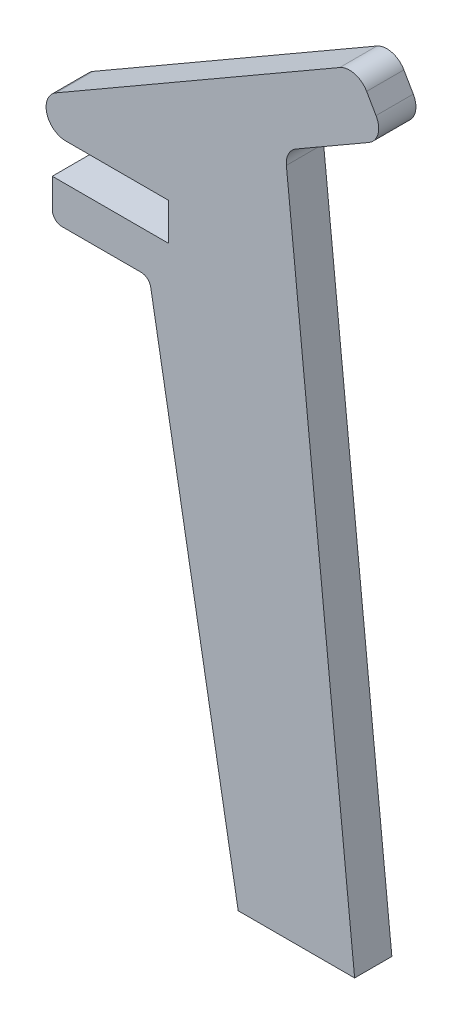
ISO-10303-21;
HEADER;
FILE_DESCRIPTION(('STEP AP214'),'2;1');
FILE_NAME('part.step','',(''),(''),'','','');
FILE_SCHEMA(('AUTOMOTIVE_DESIGN { 1 0 10303 214 1 1 1 1 }'));
ENDSEC;
DATA;
#1=APPLICATION_CONTEXT('core data for automotive mechanical design processes');
#2=APPLICATION_PROTOCOL_DEFINITION('international standard','automotive_design',2000,#1);
#3=PRODUCT_CONTEXT('',#1,'mechanical');
#4=PRODUCT('Part','Part','',(#3));
#5=PRODUCT_RELATED_PRODUCT_CATEGORY('part','',(#4));
#6=PRODUCT_DEFINITION_FORMATION('','',#4);
#7=PRODUCT_DEFINITION_CONTEXT('part definition',#1,'design');
#8=PRODUCT_DEFINITION('design','',#6,#7);
#9=PRODUCT_DEFINITION_SHAPE('','',#8);
#10=(LENGTH_UNIT() NAMED_UNIT(*) SI_UNIT(.MILLI.,.METRE.));
#11=(NAMED_UNIT(*) PLANE_ANGLE_UNIT() SI_UNIT($,.RADIAN.));
#12=(NAMED_UNIT(*) SI_UNIT($,.STERADIAN.) SOLID_ANGLE_UNIT());
#13=UNCERTAINTY_MEASURE_WITH_UNIT(LENGTH_MEASURE(1.E-05),#10,'distance_accuracy_value','');
#14=(GEOMETRIC_REPRESENTATION_CONTEXT(3) GLOBAL_UNCERTAINTY_ASSIGNED_CONTEXT((#13)) GLOBAL_UNIT_ASSIGNED_CONTEXT((#10,
#11,#12)) REPRESENTATION_CONTEXT('',''));
#15=CARTESIAN_POINT('',(0.,0.,0.));
#16=DIRECTION('',(0.,0.,1.));
#17=DIRECTION('',(1.,0.,0.));
#18=AXIS2_PLACEMENT_3D('',#15,#16,#17);
#19=CARTESIAN_POINT('',(126.999999999998,-104.967938073636,6.096));
#20=DIRECTION('',(-0.499999999999995,0.866025403784441,0.));
#21=DIRECTION('',(-0.866025403784441,-0.499999999999995,0.));
#22=AXIS2_PLACEMENT_3D('',#19,#20,#21);
#23=PLANE('',#22);
#24=DIRECTION('',(0.866025403784441,0.499999999999995,0.));
#25=VECTOR('',#24,1.);
#26=CARTESIAN_POINT('',(126.999999999998,-104.967938073636,6.096));
#27=LINE('',#26,#25);
#28=CARTESIAN_POINT('',(130.61499035934,-102.880822416552,6.096));
#29=VERTEX_POINT('',#28);
#30=CARTESIAN_POINT('',(154.409704029776,-89.1429380736364,6.096));
#31=VERTEX_POINT('',#30);
#32=EDGE_CURVE('E225',#29,#31,#27,.T.);
#33=ORIENTED_EDGE('',*,*,#32,.F.);
#34=DIRECTION('',(0.,0.,-1.));
#35=VECTOR('',#34,1.);
#36=CARTESIAN_POINT('',(130.61499035934,-102.880822416552,-6.096));
#37=LINE('',#36,#35);
#38=CARTESIAN_POINT('',(130.61499035934,-102.880822416552,-6.096));
#39=VERTEX_POINT('',#38);
#40=EDGE_CURVE('E254',#29,#39,#37,.T.);
#41=ORIENTED_EDGE('',*,*,#40,.T.);
#42=DIRECTION('',(0.866025403784441,0.499999999999995,0.));
#43=VECTOR('',#42,1.);
#44=CARTESIAN_POINT('',(126.999999999998,-104.967938073636,-6.096));
#45=LINE('',#44,#43);
#46=CARTESIAN_POINT('',(154.409704029776,-89.1429380736364,-6.096));
#47=VERTEX_POINT('',#46);
#48=EDGE_CURVE('E199',#39,#47,#45,.T.);
#49=ORIENTED_EDGE('',*,*,#48,.T.);
#50=DIRECTION('',(0.,0.,-1.));
#51=VECTOR('',#50,1.);
#52=CARTESIAN_POINT('',(154.409704029776,-89.1429380736364,6.096));
#53=LINE('',#52,#51);
#54=EDGE_CURVE('E252',#47,#31,#53,.F.);
#55=ORIENTED_EDGE('',*,*,#54,.T.);
#56=EDGE_LOOP('',(#33,#41,#49,#55));
#57=FACE_BOUND('',#56,.T.);
#58=ADVANCED_FACE('F35',(#57),#23,.F.);
#59=CARTESIAN_POINT('',(159.995567884185,-85.9179380736364,6.096));
#60=DIRECTION('',(-0.866025403784442,-0.499999999999995,0.));
#61=DIRECTION('',(0.499999999999995,-0.866025403784442,0.));
#62=AXIS2_PLACEMENT_3D('',#59,#60,#61);
#63=PLANE('',#62);
#64=DIRECTION('',(-0.499999999999995,0.866025403784442,0.));
#65=VECTOR('',#64,1.);
#66=CARTESIAN_POINT('',(159.995567884185,-85.9179380736364,-6.096));
#67=LINE('',#66,#65);
#68=CARTESIAN_POINT('',(156.770567884185,-80.3320742192267,-6.096));
#69=VERTEX_POINT('',#68);
#70=CARTESIAN_POINT('',(153.695567884185,-75.0060179859524,-6.096));
#71=VERTEX_POINT('',#70);
#72=EDGE_CURVE('E202',#69,#71,#67,.T.);
#73=ORIENTED_EDGE('',*,*,#72,.T.);
#74=DIRECTION('',(0.,0.,-1.));
#75=VECTOR('',#74,1.);
#76=CARTESIAN_POINT('',(153.695567884185,-75.0060179859524,6.096));
#77=LINE('',#76,#75);
#78=CARTESIAN_POINT('',(153.695567884185,-75.0060179859524,6.096));
#79=VERTEX_POINT('',#78);
#80=EDGE_CURVE('E262',#71,#79,#77,.F.);
#81=ORIENTED_EDGE('',*,*,#80,.T.);
#82=DIRECTION('',(-0.499999999999995,0.866025403784442,0.));
#83=VECTOR('',#82,1.);
#84=CARTESIAN_POINT('',(159.995567884185,-85.9179380736364,6.096));
#85=LINE('',#84,#83);
#86=CARTESIAN_POINT('',(156.770567884185,-80.3320742192267,6.096));
#87=VERTEX_POINT('',#86);
#88=EDGE_CURVE('E322',#87,#79,#85,.T.);
#89=ORIENTED_EDGE('',*,*,#88,.F.);
#90=DIRECTION('',(0.,0.,-1.));
#91=VECTOR('',#90,1.);
#92=CARTESIAN_POINT('',(156.770567884185,-80.3320742192267,6.096));
#93=LINE('',#92,#91);
#94=EDGE_CURVE('E259',#87,#69,#93,.T.);
#95=ORIENTED_EDGE('',*,*,#94,.T.);
#96=EDGE_LOOP('',(#73,#81,#89,#95));
#97=FACE_BOUND('',#96,.T.);
#98=ADVANCED_FACE('F319',(#97),#63,.F.);
#99=CARTESIAN_POINT('',(150.470567884185,-69.4201541315428,6.096));
#100=DIRECTION('',(0.499999999999995,-0.866025403784442,0.));
#101=DIRECTION('',(0.866025403784442,0.499999999999995,0.));
#102=AXIS2_PLACEMENT_3D('',#99,#100,#101);
#103=PLANE('',#102);
#104=DIRECTION('',(-0.866025403784442,-0.499999999999995,0.));
#105=VECTOR('',#104,1.);
#106=CARTESIAN_POINT('',(150.470567884185,-69.4201541315428,-6.096));
#107=LINE('',#106,#105);
#108=CARTESIAN_POINT('',(144.884704029776,-72.6451541315427,-6.096));
#109=VERTEX_POINT('',#108);
#110=CARTESIAN_POINT('',(51.9927334216008,-126.276358367727,-6.096));
#111=VERTEX_POINT('',#110);
#112=EDGE_CURVE('E205',#109,#111,#107,.T.);
#113=ORIENTED_EDGE('',*,*,#112,.T.);
#114=DIRECTION('',(0.,0.,-1.));
#115=VECTOR('',#114,1.);
#116=CARTESIAN_POINT('',(51.9927334216008,-126.276358367727,6.096));
#117=LINE('',#116,#115);
#118=CARTESIAN_POINT('',(51.9927334216008,-126.276358367727,6.096));
#119=VERTEX_POINT('',#118);
#120=EDGE_CURVE('E245',#111,#119,#117,.F.);
#121=ORIENTED_EDGE('',*,*,#120,.T.);
#122=DIRECTION('',(-0.866025403784442,-0.499999999999995,0.));
#123=VECTOR('',#122,1.);
#124=CARTESIAN_POINT('',(150.470567884185,-69.4201541315428,6.096));
#125=LINE('',#124,#123);
#126=CARTESIAN_POINT('',(144.884704029776,-72.6451541315427,6.096));
#127=VERTEX_POINT('',#126);
#128=EDGE_CURVE('E166',#127,#119,#125,.T.);
#129=ORIENTED_EDGE('',*,*,#128,.F.);
#130=DIRECTION('',(0.,0.,-1.));
#131=VECTOR('',#130,1.);
#132=CARTESIAN_POINT('',(144.884704029776,-72.6451541315427,6.096));
#133=LINE('',#132,#131);
#134=EDGE_CURVE('E242',#127,#109,#133,.T.);
#135=ORIENTED_EDGE('',*,*,#134,.T.);
#136=EDGE_LOOP('',(#113,#121,#129,#135));
#137=FACE_BOUND('',#136,.T.);
#138=ADVANCED_FACE('F348',(#137),#103,.F.);
#139=CARTESIAN_POINT('',(31.1460057127812,-138.312222222136,6.096));
#140=DIRECTION('',(0.,1.,0.));
#141=DIRECTION('',(-1.,0.,0.));
#142=AXIS2_PLACEMENT_3D('',#139,#140,#141);
#143=PLANE('',#142);
#144=DIRECTION('',(1.,0.,0.));
#145=VECTOR('',#144,1.);
#146=CARTESIAN_POINT('',(31.1460057127812,-138.312222222136,6.096));
#147=LINE('',#146,#145);
#148=CARTESIAN_POINT('',(55.2177334216008,-138.312222222136,6.096));
#149=VERTEX_POINT('',#148);
#150=CARTESIAN_POINT('',(88.9,-138.312222222136,6.096));
#151=VERTEX_POINT('',#150);
#152=EDGE_CURVE('E154',#149,#151,#147,.T.);
#153=ORIENTED_EDGE('',*,*,#152,.F.);
#154=DIRECTION('',(0.,0.,-1.));
#155=VECTOR('',#154,1.);
#156=CARTESIAN_POINT('',(55.2177334216008,-138.312222222136,6.096));
#157=LINE('',#156,#155);
#158=CARTESIAN_POINT('',(55.2177334216008,-138.312222222136,-6.096));
#159=VERTEX_POINT('',#158);
#160=EDGE_CURVE('E175',#149,#159,#157,.T.);
#161=ORIENTED_EDGE('',*,*,#160,.T.);
#162=DIRECTION('',(1.,0.,0.));
#163=VECTOR('',#162,1.);
#164=CARTESIAN_POINT('',(31.1460057127812,-138.312222222136,-6.096));
#165=LINE('',#164,#163);
#166=CARTESIAN_POINT('',(88.9,-138.312222222136,-6.096));
#167=VERTEX_POINT('',#166);
#168=EDGE_CURVE('E172',#159,#167,#165,.T.);
#169=ORIENTED_EDGE('',*,*,#168,.T.);
#170=DIRECTION('',(0.,0.,-1.));
#171=VECTOR('',#170,1.);
#172=CARTESIAN_POINT('',(88.9,-138.312222222136,6.096));
#173=LINE('',#172,#171);
#174=EDGE_CURVE('E169',#151,#167,#173,.T.);
#175=ORIENTED_EDGE('',*,*,#174,.F.);
#176=EDGE_LOOP('',(#153,#161,#169,#175));
#177=FACE_BOUND('',#176,.T.);
#178=ADVANCED_FACE('F170',(#177),#143,.F.);
#179=CARTESIAN_POINT('',(88.9,-138.312222222136,6.096));
#180=DIRECTION('',(1.,0.,0.));
#181=DIRECTION('',(0.,0.,-1.));
#182=AXIS2_PLACEMENT_3D('',#179,#180,#181);
#183=PLANE('',#182);
#184=DIRECTION('',(0.,-1.,0.));
#185=VECTOR('',#184,1.);
#186=CARTESIAN_POINT('',(88.9,-138.312222222136,-6.096));
#187=LINE('',#186,#185);
#188=CARTESIAN_POINT('',(88.9,-150.504222222136,-6.096));
#189=VERTEX_POINT('',#188);
#190=EDGE_CURVE('E209',#167,#189,#187,.T.);
#191=ORIENTED_EDGE('',*,*,#190,.T.);
#192=DIRECTION('',(0.,0.,-1.));
#193=VECTOR('',#192,1.);
#194=CARTESIAN_POINT('',(88.9,-150.504222222136,6.096));
#195=LINE('',#194,#193);
#196=CARTESIAN_POINT('',(88.9,-150.504222222136,6.096));
#197=VERTEX_POINT('',#196);
#198=EDGE_CURVE('E176',#197,#189,#195,.T.);
#199=ORIENTED_EDGE('',*,*,#198,.F.);
#200=DIRECTION('',(0.,-1.,0.));
#201=VECTOR('',#200,1.);
#202=CARTESIAN_POINT('',(88.9,-138.312222222136,6.096));
#203=LINE('',#202,#201);
#204=EDGE_CURVE('E158',#151,#197,#203,.T.);
#205=ORIENTED_EDGE('',*,*,#204,.F.);
#206=ORIENTED_EDGE('',*,*,#174,.T.);
#207=EDGE_LOOP('',(#191,#199,#205,#206));
#208=FACE_BOUND('',#207,.T.);
#209=ADVANCED_FACE('F178',(#208),#183,.F.);
#210=CARTESIAN_POINT('',(50.8,-150.504222222136,6.096));
#211=DIRECTION('',(0.,-1.,0.));
#212=DIRECTION('',(1.,0.,0.));
#213=AXIS2_PLACEMENT_3D('',#210,#211,#212);
#214=PLANE('',#213);
#215=DIRECTION('',(-1.,0.,0.));
#216=VECTOR('',#215,1.);
#217=CARTESIAN_POINT('',(50.8,-150.504222222136,-6.096));
#218=LINE('',#217,#216);
#219=CARTESIAN_POINT('',(50.8,-150.504222222136,-6.096));
#220=VERTEX_POINT('',#219);
#221=EDGE_CURVE('E211',#189,#220,#218,.T.);
#222=ORIENTED_EDGE('',*,*,#221,.T.);
#223=DIRECTION('',(0.,0.,-1.));
#224=VECTOR('',#223,1.);
#225=CARTESIAN_POINT('',(50.8,-150.504222222136,6.096));
#226=LINE('',#225,#224);
#227=CARTESIAN_POINT('',(50.8,-150.504222222136,6.096));
#228=VERTEX_POINT('',#227);
#229=EDGE_CURVE('E231',#228,#220,#226,.T.);
#230=ORIENTED_EDGE('',*,*,#229,.F.);
#231=DIRECTION('',(-1.,0.,0.));
#232=VECTOR('',#231,1.);
#233=CARTESIAN_POINT('',(50.8,-150.504222222136,6.096));
#234=LINE('',#233,#232);
#235=EDGE_CURVE('E181',#197,#228,#234,.T.);
#236=ORIENTED_EDGE('',*,*,#235,.F.);
#237=ORIENTED_EDGE('',*,*,#198,.T.);
#238=EDGE_LOOP('',(#222,#230,#236,#237));
#239=FACE_BOUND('',#238,.T.);
#240=ADVANCED_FACE('F335',(#239),#214,.F.);
#241=CARTESIAN_POINT('',(50.8,-163.204222222136,6.096));
#242=DIRECTION('',(1.,0.,0.));
#243=DIRECTION('',(0.,1.,0.));
#244=AXIS2_PLACEMENT_3D('',#241,#242,#243);
#245=PLANE('',#244);
#246=DIRECTION('',(0.,-1.,0.));
#247=VECTOR('',#246,1.);
#248=CARTESIAN_POINT('',(50.8,-163.204222222136,-6.096));
#249=LINE('',#248,#247);
#250=CARTESIAN_POINT('',(50.8,-160.029222222136,-6.096));
#251=VERTEX_POINT('',#250);
#252=EDGE_CURVE('E213',#220,#251,#249,.T.);
#253=ORIENTED_EDGE('',*,*,#252,.T.);
#254=DIRECTION('',(0.,0.,-1.));
#255=VECTOR('',#254,1.);
#256=CARTESIAN_POINT('',(50.8,-160.029222222136,6.096));
#257=LINE('',#256,#255);
#258=CARTESIAN_POINT('',(50.8,-160.029222222136,6.096));
#259=VERTEX_POINT('',#258);
#260=EDGE_CURVE('E50',#251,#259,#257,.F.);
#261=ORIENTED_EDGE('',*,*,#260,.T.);
#262=DIRECTION('',(0.,-1.,0.));
#263=VECTOR('',#262,1.);
#264=CARTESIAN_POINT('',(50.8,-163.204222222136,6.096));
#265=LINE('',#264,#263);
#266=EDGE_CURVE('E183',#228,#259,#265,.T.);
#267=ORIENTED_EDGE('',*,*,#266,.F.);
#268=ORIENTED_EDGE('',*,*,#229,.T.);
#269=EDGE_LOOP('',(#253,#261,#267,#268));
#270=FACE_BOUND('',#269,.T.);
#271=ADVANCED_FACE('F412',(#270),#245,.F.);
#272=CARTESIAN_POINT('',(82.55,-163.204222222136,6.096));
#273=DIRECTION('',(0.,1.,0.));
#274=DIRECTION('',(-1.,0.,0.));
#275=AXIS2_PLACEMENT_3D('',#272,#273,#274);
#276=PLANE('',#275);
#277=DIRECTION('',(1.,0.,0.));
#278=VECTOR('',#277,1.);
#279=CARTESIAN_POINT('',(82.55,-163.204222222136,-6.096));
#280=LINE('',#279,#278);
#281=CARTESIAN_POINT('',(53.975,-163.204222222136,-6.096));
#282=VERTEX_POINT('',#281);
#283=CARTESIAN_POINT('',(79.8858586710122,-163.204222222136,-6.096));
#284=VERTEX_POINT('',#283);
#285=EDGE_CURVE('E215',#282,#284,#280,.T.);
#286=ORIENTED_EDGE('',*,*,#285,.T.);
#287=DIRECTION('',(0.,0.,-1.));
#288=VECTOR('',#287,1.);
#289=CARTESIAN_POINT('',(79.8858586710122,-163.204222222136,6.096));
#290=LINE('',#289,#288);
#291=CARTESIAN_POINT('',(79.8858586710122,-163.204222222136,6.096));
#292=VERTEX_POINT('',#291);
#293=EDGE_CURVE('E274',#284,#292,#290,.F.);
#294=ORIENTED_EDGE('',*,*,#293,.T.);
#295=DIRECTION('',(1.,0.,0.));
#296=VECTOR('',#295,1.);
#297=CARTESIAN_POINT('',(82.55,-163.204222222136,6.096));
#298=LINE('',#297,#296);
#299=CARTESIAN_POINT('',(53.975,-163.204222222136,6.096));
#300=VERTEX_POINT('',#299);
#301=EDGE_CURVE('E188',#300,#292,#298,.T.);
#302=ORIENTED_EDGE('',*,*,#301,.F.);
#303=DIRECTION('',(0.,0.,-1.));
#304=VECTOR('',#303,1.);
#305=CARTESIAN_POINT('',(53.975,-163.204222222136,6.096));
#306=LINE('',#305,#304);
#307=EDGE_CURVE('E271',#300,#282,#306,.T.);
#308=ORIENTED_EDGE('',*,*,#307,.T.);
#309=EDGE_LOOP('',(#286,#294,#302,#308));
#310=FACE_BOUND('',#309,.T.);
#311=ADVANCED_FACE('F286',(#310),#276,.F.);
#312=CARTESIAN_POINT('',(82.55,-163.204222222136,6.096));
#313=DIRECTION('',(0.984807753012208,0.173648177666931,0.));
#314=DIRECTION('',(-0.173648177666931,0.984807753012208,0.));
#315=AXIS2_PLACEMENT_3D('',#312,#313,#314);
#316=PLANE('',#315);
#317=DIRECTION('',(0.173648177666931,-0.984807753012208,0.));
#318=VECTOR('',#317,1.);
#319=CARTESIAN_POINT('',(82.55,-163.204222222136,6.096));
#320=LINE('',#319,#318);
#321=CARTESIAN_POINT('',(83.0126232868259,-165.827889258044,6.096));
#322=VERTEX_POINT('',#321);
#323=CARTESIAN_POINT('',(111.661584514968,-328.304222222136,6.096));
#324=VERTEX_POINT('',#323);
#325=EDGE_CURVE('E191',#322,#324,#320,.T.);
#326=ORIENTED_EDGE('',*,*,#325,.F.);
#327=DIRECTION('',(0.,0.,-1.));
#328=VECTOR('',#327,1.);
#329=CARTESIAN_POINT('',(83.0126232868259,-165.827889258044,-6.096));
#330=LINE('',#329,#328);
#331=CARTESIAN_POINT('',(83.0126232868259,-165.827889258044,-6.096));
#332=VERTEX_POINT('',#331);
#333=EDGE_CURVE('E268',#322,#332,#330,.T.);
#334=ORIENTED_EDGE('',*,*,#333,.T.);
#335=DIRECTION('',(0.173648177666931,-0.984807753012208,0.));
#336=VECTOR('',#335,1.);
#337=CARTESIAN_POINT('',(82.55,-163.204222222136,-6.096));
#338=LINE('',#337,#336);
#339=CARTESIAN_POINT('',(111.661584514968,-328.304222222136,-6.096));
#340=VERTEX_POINT('',#339);
#341=EDGE_CURVE('E218',#332,#340,#338,.T.);
#342=ORIENTED_EDGE('',*,*,#341,.T.);
#343=DIRECTION('',(0.,0.,-1.));
#344=VECTOR('',#343,1.);
#345=CARTESIAN_POINT('',(111.661584514968,-328.304222222136,6.096));
#346=LINE('',#345,#344);
#347=EDGE_CURVE('E228',#324,#340,#346,.T.);
#348=ORIENTED_EDGE('',*,*,#347,.F.);
#349=EDGE_LOOP('',(#326,#334,#342,#348));
#350=FACE_BOUND('',#349,.T.);
#351=ADVANCED_FACE('F294',(#350),#316,.F.);
#352=CARTESIAN_POINT('',(111.661584514968,-328.304222222136,6.096));
#353=DIRECTION('',(0.,1.,0.));
#354=DIRECTION('',(-1.,0.,0.));
#355=AXIS2_PLACEMENT_3D('',#352,#353,#354);
#356=PLANE('',#355);
#357=DIRECTION('',(1.,0.,0.));
#358=VECTOR('',#357,1.);
#359=CARTESIAN_POINT('',(111.661584514968,-328.304222222136,-6.096));
#360=LINE('',#359,#358);
#361=CARTESIAN_POINT('',(149.761584514968,-328.304222222136,-6.096));
#362=VERTEX_POINT('',#361);
#363=EDGE_CURVE('E220',#340,#362,#360,.T.);
#364=ORIENTED_EDGE('',*,*,#363,.T.);
#365=DIRECTION('',(0.,0.,-1.));
#366=VECTOR('',#365,1.);
#367=CARTESIAN_POINT('',(149.761584514968,-328.304222222136,6.096));
#368=LINE('',#367,#366);
#369=CARTESIAN_POINT('',(149.761584514968,-328.304222222136,6.096));
#370=VERTEX_POINT('',#369);
#371=EDGE_CURVE('E198',#370,#362,#368,.T.);
#372=ORIENTED_EDGE('',*,*,#371,.F.);
#373=DIRECTION('',(1.,0.,0.));
#374=VECTOR('',#373,1.);
#375=CARTESIAN_POINT('',(111.661584514968,-328.304222222136,6.096));
#376=LINE('',#375,#374);
#377=EDGE_CURVE('E193',#324,#370,#376,.T.);
#378=ORIENTED_EDGE('',*,*,#377,.F.);
#379=ORIENTED_EDGE('',*,*,#347,.T.);
#380=EDGE_LOOP('',(#364,#372,#378,#379));
#381=FACE_BOUND('',#380,.T.);
#382=ADVANCED_FACE('F298',(#381),#356,.F.);
#383=CARTESIAN_POINT('',(149.761584514968,-328.304222222136,6.096));
#384=DIRECTION('',(-0.99484665542279,-0.101390986749758,0.));
#385=DIRECTION('',(0.101390986749758,-0.99484665542279,0.));
#386=AXIS2_PLACEMENT_3D('',#383,#384,#385);
#387=PLANE('',#386);
#388=DIRECTION('',(-0.101390986749758,0.99484665542279,0.));
#389=VECTOR('',#388,1.);
#390=CARTESIAN_POINT('',(149.761584514968,-328.304222222136,-6.096));
#391=LINE('',#390,#389);
#392=CARTESIAN_POINT('',(127.423229431863,-109.120658135498,-6.096));
#393=VERTEX_POINT('',#392);
#394=EDGE_CURVE('E222',#362,#393,#391,.T.);
#395=ORIENTED_EDGE('',*,*,#394,.T.);
#396=DIRECTION('',(0.,0.,-1.));
#397=VECTOR('',#396,1.);
#398=CARTESIAN_POINT('',(127.423229431863,-109.120658135498,6.096));
#399=LINE('',#398,#397);
#400=CARTESIAN_POINT('',(127.423229431863,-109.120658135498,6.096));
#401=VERTEX_POINT('',#400);
#402=EDGE_CURVE('E257',#393,#401,#399,.F.);
#403=ORIENTED_EDGE('',*,*,#402,.T.);
#404=DIRECTION('',(-0.101390986749758,0.99484665542279,0.));
#405=VECTOR('',#404,1.);
#406=CARTESIAN_POINT('',(149.761584514968,-328.304222222136,6.096));
#407=LINE('',#406,#405);
#408=EDGE_CURVE('E195',#370,#401,#407,.T.);
#409=ORIENTED_EDGE('',*,*,#408,.F.);
#410=ORIENTED_EDGE('',*,*,#371,.T.);
#411=EDGE_LOOP('',(#395,#403,#409,#410));
#412=FACE_BOUND('',#411,.T.);
#413=ADVANCED_FACE('F392',(#412),#387,.F.);
#414=CARTESIAN_POINT('',(0.,0.,6.096));
#415=DIRECTION('',(0.,0.,1.));
#416=DIRECTION('',(1.,0.,0.));
#417=AXIS2_PLACEMENT_3D('',#414,#415,#416);
#418=PLANE('',#417);
#419=ORIENTED_EDGE('',*,*,#266,.T.);
#420=CARTESIAN_POINT('',(53.975,-160.029222222136,6.096));
#421=DIRECTION('',(0.,0.,1.));
#422=DIRECTION('',(1.,0.,0.));
#423=AXIS2_PLACEMENT_3D('',#420,#421,#422);
#424=CIRCLE('',#423,3.175);
#425=EDGE_CURVE('E278',#259,#300,#424,.T.);
#426=ORIENTED_EDGE('',*,*,#425,.T.);
#427=ORIENTED_EDGE('',*,*,#301,.T.);
#428=CARTESIAN_POINT('',(79.8858586710122,-166.379222222136,6.096));
#429=DIRECTION('',(0.,0.,1.));
#430=DIRECTION('',(1.,0.,0.));
#431=AXIS2_PLACEMENT_3D('',#428,#429,#430);
#432=CIRCLE('',#431,3.175);
#433=EDGE_CURVE('E11',#292,#322,#432,.F.);
#434=ORIENTED_EDGE('',*,*,#433,.T.);
#435=ORIENTED_EDGE('',*,*,#325,.T.);
#436=ORIENTED_EDGE('',*,*,#377,.T.);
#437=ORIENTED_EDGE('',*,*,#408,.T.);
#438=CARTESIAN_POINT('',(133.83999035934,-108.466686270962,6.096));
#439=DIRECTION('',(0.,0.,1.));
#440=DIRECTION('',(1.,0.,0.));
#441=AXIS2_PLACEMENT_3D('',#438,#439,#440);
#442=CIRCLE('',#441,6.45);
#443=EDGE_CURVE('E266',#401,#29,#442,.F.);
#444=ORIENTED_EDGE('',*,*,#443,.T.);
#445=ORIENTED_EDGE('',*,*,#32,.T.);
#446=CARTESIAN_POINT('',(151.184704029776,-83.5570742192267,6.096));
#447=DIRECTION('',(0.,0.,1.));
#448=DIRECTION('',(1.,0.,0.));
#449=AXIS2_PLACEMENT_3D('',#446,#447,#448);
#450=CIRCLE('',#449,6.45);
#451=EDGE_CURVE('E247',#31,#87,#450,.T.);
#452=ORIENTED_EDGE('',*,*,#451,.T.);
#453=ORIENTED_EDGE('',*,*,#88,.T.);
#454=CARTESIAN_POINT('',(148.109704029776,-78.2310179859524,6.096));
#455=DIRECTION('',(0.,0.,1.));
#456=DIRECTION('',(1.,0.,0.));
#457=AXIS2_PLACEMENT_3D('',#454,#455,#456);
#458=CIRCLE('',#457,6.45);
#459=EDGE_CURVE('E249',#79,#127,#458,.T.);
#460=ORIENTED_EDGE('',*,*,#459,.T.);
#461=ORIENTED_EDGE('',*,*,#128,.T.);
#462=CARTESIAN_POINT('',(55.2177334216008,-131.862222222136,6.096));
#463=DIRECTION('',(0.,0.,1.));
#464=DIRECTION('',(1.,0.,0.));
#465=AXIS2_PLACEMENT_3D('',#462,#463,#464);
#466=CIRCLE('',#465,6.45);
#467=EDGE_CURVE('E162',#119,#149,#466,.T.);
#468=ORIENTED_EDGE('',*,*,#467,.T.);
#469=ORIENTED_EDGE('',*,*,#152,.T.);
#470=ORIENTED_EDGE('',*,*,#204,.T.);
#471=ORIENTED_EDGE('',*,*,#235,.T.);
#472=EDGE_LOOP('',(#419,#426,#427,#434,#435,#436,#437,#444,#445,#452,#453,#460,#461,#468,#469,
#470,#471));
#473=FACE_BOUND('',#472,.T.);
#474=ADVANCED_FACE('F156',(#473),#418,.T.);
#475=CARTESIAN_POINT('',(0.,0.,-6.096));
#476=DIRECTION('',(0.,0.,1.));
#477=DIRECTION('',(1.,0.,0.));
#478=AXIS2_PLACEMENT_3D('',#475,#476,#477);
#479=PLANE('',#478);
#480=ORIENTED_EDGE('',*,*,#285,.F.);
#481=CARTESIAN_POINT('',(53.975,-160.029222222136,-6.096));
#482=DIRECTION('',(0.,0.,1.));
#483=DIRECTION('',(1.,0.,0.));
#484=AXIS2_PLACEMENT_3D('',#481,#482,#483);
#485=CIRCLE('',#484,3.175);
#486=EDGE_CURVE('E58',#282,#251,#485,.F.);
#487=ORIENTED_EDGE('',*,*,#486,.T.);
#488=ORIENTED_EDGE('',*,*,#252,.F.);
#489=ORIENTED_EDGE('',*,*,#221,.F.);
#490=ORIENTED_EDGE('',*,*,#190,.F.);
#491=ORIENTED_EDGE('',*,*,#168,.F.);
#492=CARTESIAN_POINT('',(55.2177334216008,-131.862222222136,-6.096));
#493=DIRECTION('',(0.,0.,1.));
#494=DIRECTION('',(1.,0.,0.));
#495=AXIS2_PLACEMENT_3D('',#492,#493,#494);
#496=CIRCLE('',#495,6.45);
#497=EDGE_CURVE('E240',#159,#111,#496,.F.);
#498=ORIENTED_EDGE('',*,*,#497,.T.);
#499=ORIENTED_EDGE('',*,*,#112,.F.);
#500=CARTESIAN_POINT('',(148.109704029776,-78.2310179859524,-6.096));
#501=DIRECTION('',(0.,0.,1.));
#502=DIRECTION('',(1.,0.,0.));
#503=AXIS2_PLACEMENT_3D('',#500,#501,#502);
#504=CIRCLE('',#503,6.45);
#505=EDGE_CURVE('E238',#109,#71,#504,.F.);
#506=ORIENTED_EDGE('',*,*,#505,.T.);
#507=ORIENTED_EDGE('',*,*,#72,.F.);
#508=CARTESIAN_POINT('',(151.184704029776,-83.5570742192267,-6.096));
#509=DIRECTION('',(0.,0.,1.));
#510=DIRECTION('',(1.,0.,0.));
#511=AXIS2_PLACEMENT_3D('',#508,#509,#510);
#512=CIRCLE('',#511,6.45);
#513=EDGE_CURVE('E236',#69,#47,#512,.F.);
#514=ORIENTED_EDGE('',*,*,#513,.T.);
#515=ORIENTED_EDGE('',*,*,#48,.F.);
#516=CARTESIAN_POINT('',(133.83999035934,-108.466686270962,-6.096));
#517=DIRECTION('',(0.,0.,1.));
#518=DIRECTION('',(1.,0.,0.));
#519=AXIS2_PLACEMENT_3D('',#516,#517,#518);
#520=CIRCLE('',#519,6.45);
#521=EDGE_CURVE('E264',#39,#393,#520,.T.);
#522=ORIENTED_EDGE('',*,*,#521,.T.);
#523=ORIENTED_EDGE('',*,*,#394,.F.);
#524=ORIENTED_EDGE('',*,*,#363,.F.);
#525=ORIENTED_EDGE('',*,*,#341,.F.);
#526=CARTESIAN_POINT('',(79.8858586710122,-166.379222222136,-6.096));
#527=DIRECTION('',(0.,0.,1.));
#528=DIRECTION('',(1.,0.,0.));
#529=AXIS2_PLACEMENT_3D('',#526,#527,#528);
#530=CIRCLE('',#529,3.175);
#531=EDGE_CURVE('E43',#332,#284,#530,.T.);
#532=ORIENTED_EDGE('',*,*,#531,.T.);
#533=EDGE_LOOP('',(#480,#487,#488,#489,#490,#491,#498,#499,#506,#507,#514,#515,#522,#523,#524,
#525,#532));
#534=FACE_BOUND('',#533,.T.);
#535=ADVANCED_FACE('F280',(#534),#479,.F.);
#536=CARTESIAN_POINT('',(55.2177334216008,-131.862222222136,6.096));
#537=DIRECTION('',(0.,0.,-1.));
#538=DIRECTION('',(-1.,0.,0.));
#539=AXIS2_PLACEMENT_3D('',#536,#537,#538);
#540=CYLINDRICAL_SURFACE('',#539,6.45);
#541=ORIENTED_EDGE('',*,*,#467,.F.);
#542=ORIENTED_EDGE('',*,*,#120,.F.);
#543=ORIENTED_EDGE('',*,*,#497,.F.);
#544=ORIENTED_EDGE('',*,*,#160,.F.);
#545=EDGE_LOOP('',(#541,#542,#543,#544));
#546=FACE_BOUND('',#545,.T.);
#547=ADVANCED_FACE('F331',(#546),#540,.T.);
#548=CARTESIAN_POINT('',(133.83999035934,-108.466686270962,6.096));
#549=DIRECTION('',(0.,0.,1.));
#550=DIRECTION('',(1.,0.,0.));
#551=AXIS2_PLACEMENT_3D('',#548,#549,#550);
#552=CYLINDRICAL_SURFACE('',#551,6.45);
#553=ORIENTED_EDGE('',*,*,#443,.F.);
#554=ORIENTED_EDGE('',*,*,#402,.F.);
#555=ORIENTED_EDGE('',*,*,#521,.F.);
#556=ORIENTED_EDGE('',*,*,#40,.F.);
#557=EDGE_LOOP('',(#553,#554,#555,#556));
#558=FACE_BOUND('',#557,.T.);
#559=ADVANCED_FACE('F307',(#558),#552,.F.);
#560=CARTESIAN_POINT('',(148.109704029776,-78.2310179859524,6.096));
#561=DIRECTION('',(0.,0.,-1.));
#562=DIRECTION('',(-1.,0.,0.));
#563=AXIS2_PLACEMENT_3D('',#560,#561,#562);
#564=CYLINDRICAL_SURFACE('',#563,6.45);
#565=ORIENTED_EDGE('',*,*,#459,.F.);
#566=ORIENTED_EDGE('',*,*,#80,.F.);
#567=ORIENTED_EDGE('',*,*,#505,.F.);
#568=ORIENTED_EDGE('',*,*,#134,.F.);
#569=EDGE_LOOP('',(#565,#566,#567,#568));
#570=FACE_BOUND('',#569,.T.);
#571=ADVANCED_FACE('F356',(#570),#564,.T.);
#572=CARTESIAN_POINT('',(151.184704029776,-83.5570742192267,6.096));
#573=DIRECTION('',(0.,0.,-1.));
#574=DIRECTION('',(-1.,0.,0.));
#575=AXIS2_PLACEMENT_3D('',#572,#573,#574);
#576=CYLINDRICAL_SURFACE('',#575,6.45);
#577=ORIENTED_EDGE('',*,*,#451,.F.);
#578=ORIENTED_EDGE('',*,*,#54,.F.);
#579=ORIENTED_EDGE('',*,*,#513,.F.);
#580=ORIENTED_EDGE('',*,*,#94,.F.);
#581=EDGE_LOOP('',(#577,#578,#579,#580));
#582=FACE_BOUND('',#581,.T.);
#583=ADVANCED_FACE('F316',(#582),#576,.T.);
#584=CARTESIAN_POINT('',(79.8858586710122,-166.379222222136,6.096));
#585=DIRECTION('',(0.,0.,1.));
#586=DIRECTION('',(1.,0.,0.));
#587=AXIS2_PLACEMENT_3D('',#584,#585,#586);
#588=CYLINDRICAL_SURFACE('',#587,3.175);
#589=ORIENTED_EDGE('',*,*,#433,.F.);
#590=ORIENTED_EDGE('',*,*,#293,.F.);
#591=ORIENTED_EDGE('',*,*,#531,.F.);
#592=ORIENTED_EDGE('',*,*,#333,.F.);
#593=EDGE_LOOP('',(#589,#590,#591,#592));
#594=FACE_BOUND('',#593,.T.);
#595=ADVANCED_FACE('F290',(#594),#588,.F.);
#596=CARTESIAN_POINT('',(53.975,-160.029222222136,6.096));
#597=DIRECTION('',(0.,0.,-1.));
#598=DIRECTION('',(-1.,0.,0.));
#599=AXIS2_PLACEMENT_3D('',#596,#597,#598);
#600=CYLINDRICAL_SURFACE('',#599,3.175);
#601=ORIENTED_EDGE('',*,*,#425,.F.);
#602=ORIENTED_EDGE('',*,*,#260,.F.);
#603=ORIENTED_EDGE('',*,*,#486,.F.);
#604=ORIENTED_EDGE('',*,*,#307,.F.);
#605=EDGE_LOOP('',(#601,#602,#603,#604));
#606=FACE_BOUND('',#605,.T.);
#607=ADVANCED_FACE('F37',(#606),#600,.T.);
#608=CLOSED_SHELL('',(#58,#98,#138,#178,#209,#240,#271,#311,#351,#382,#413,#474,#535,#547,#559,
#571,#583,#595,#607));
#609=MANIFOLD_SOLID_BREP('B2',#608);
#610=ADVANCED_BREP_SHAPE_REPRESENTATION('',(#18,#609),#14);
#611=SHAPE_DEFINITION_REPRESENTATION(#9,#610);
ENDSEC;
END-ISO-10303-21;
